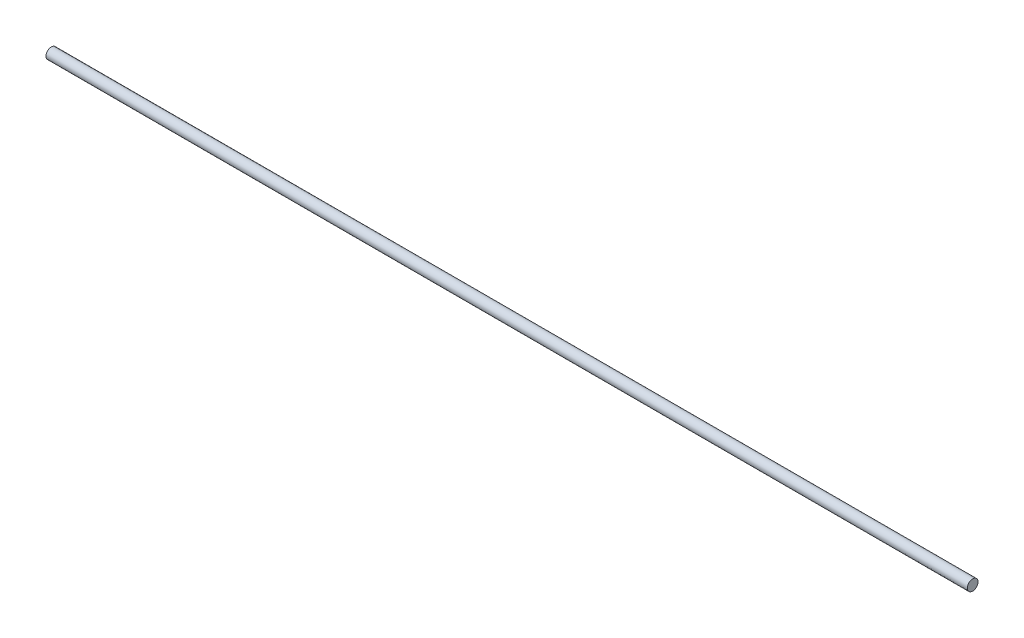
ISO-10303-21;
HEADER;
FILE_DESCRIPTION(('STEP AP214'),'2;1');
FILE_NAME('part.step','',(''),(''),'','','');
FILE_SCHEMA(('AUTOMOTIVE_DESIGN { 1 0 10303 214 1 1 1 1 }'));
ENDSEC;
DATA;
#1=APPLICATION_CONTEXT('core data for automotive mechanical design processes');
#2=APPLICATION_PROTOCOL_DEFINITION('international standard','automotive_design',2000,#1);
#3=PRODUCT_CONTEXT('',#1,'mechanical');
#4=PRODUCT('Part','Part','',(#3));
#5=PRODUCT_RELATED_PRODUCT_CATEGORY('part','',(#4));
#6=PRODUCT_DEFINITION_FORMATION('','',#4);
#7=PRODUCT_DEFINITION_CONTEXT('part definition',#1,'design');
#8=PRODUCT_DEFINITION('design','',#6,#7);
#9=PRODUCT_DEFINITION_SHAPE('','',#8);
#10=(LENGTH_UNIT() NAMED_UNIT(*) SI_UNIT(.MILLI.,.METRE.));
#11=(NAMED_UNIT(*) PLANE_ANGLE_UNIT() SI_UNIT($,.RADIAN.));
#12=(NAMED_UNIT(*) SI_UNIT($,.STERADIAN.) SOLID_ANGLE_UNIT());
#13=UNCERTAINTY_MEASURE_WITH_UNIT(LENGTH_MEASURE(1.E-05),#10,'distance_accuracy_value','');
#14=(GEOMETRIC_REPRESENTATION_CONTEXT(3) GLOBAL_UNCERTAINTY_ASSIGNED_CONTEXT((#13)) GLOBAL_UNIT_ASSIGNED_CONTEXT((#10,
#11,#12)) REPRESENTATION_CONTEXT('',''));
#15=CARTESIAN_POINT('',(0.,0.,0.));
#16=DIRECTION('',(0.,0.,1.));
#17=DIRECTION('',(1.,0.,0.));
#18=AXIS2_PLACEMENT_3D('',#15,#16,#17);
#19=CARTESIAN_POINT('',(431.8,0.,0.));
#20=DIRECTION('',(-1.,0.,0.));
#21=DIRECTION('',(0.,0.,1.));
#22=AXIS2_PLACEMENT_3D('',#19,#20,#21);
#23=CYLINDRICAL_SURFACE('',#22,2.5);
#24=CARTESIAN_POINT('',(431.8,0.,0.));
#25=DIRECTION('',(1.,0.,0.));
#26=DIRECTION('',(0.,0.,-1.));
#27=AXIS2_PLACEMENT_3D('',#24,#25,#26);
#28=CIRCLE('',#27,2.5);
#29=CARTESIAN_POINT('',(431.8,0.,-2.5));
#30=VERTEX_POINT('',#29);
#31=EDGE_CURVE('E10',#30,#30,#28,.T.);
#32=ORIENTED_EDGE('',*,*,#31,.F.);
#33=EDGE_LOOP('',(#32));
#34=FACE_BOUND('',#33,.T.);
#35=CARTESIAN_POINT('',(0.,0.,0.));
#36=DIRECTION('',(1.,0.,0.));
#37=DIRECTION('',(0.,0.,-1.));
#38=AXIS2_PLACEMENT_3D('',#35,#36,#37);
#39=CIRCLE('',#38,2.5);
#40=CARTESIAN_POINT('',(0.,0.,-2.5));
#41=VERTEX_POINT('',#40);
#42=EDGE_CURVE('E36',#41,#41,#39,.T.);
#43=ORIENTED_EDGE('',*,*,#42,.T.);
#44=EDGE_LOOP('',(#43));
#45=FACE_BOUND('',#44,.T.);
#46=ADVANCED_FACE('F33',(#34,#45),#23,.T.);
#47=CARTESIAN_POINT('',(431.8,0.,0.));
#48=DIRECTION('',(1.,0.,0.));
#49=DIRECTION('',(0.,0.,-1.));
#50=AXIS2_PLACEMENT_3D('',#47,#48,#49);
#51=PLANE('',#50);
#52=ORIENTED_EDGE('',*,*,#31,.T.);
#53=EDGE_LOOP('',(#52));
#54=FACE_BOUND('',#53,.T.);
#55=ADVANCED_FACE('F48',(#54),#51,.T.);
#56=CARTESIAN_POINT('',(0.,0.,0.));
#57=DIRECTION('',(1.,0.,0.));
#58=DIRECTION('',(0.,0.,-1.));
#59=AXIS2_PLACEMENT_3D('',#56,#57,#58);
#60=PLANE('',#59);
#61=ORIENTED_EDGE('',*,*,#42,.F.);
#62=EDGE_LOOP('',(#61));
#63=FACE_BOUND('',#62,.T.);
#64=ADVANCED_FACE('F46',(#63),#60,.F.);
#65=CLOSED_SHELL('',(#46,#55,#64));
#66=MANIFOLD_SOLID_BREP('B2',#65);
#67=ADVANCED_BREP_SHAPE_REPRESENTATION('',(#18,#66),#14);
#68=SHAPE_DEFINITION_REPRESENTATION(#9,#67);
ENDSEC;
END-ISO-10303-21;
